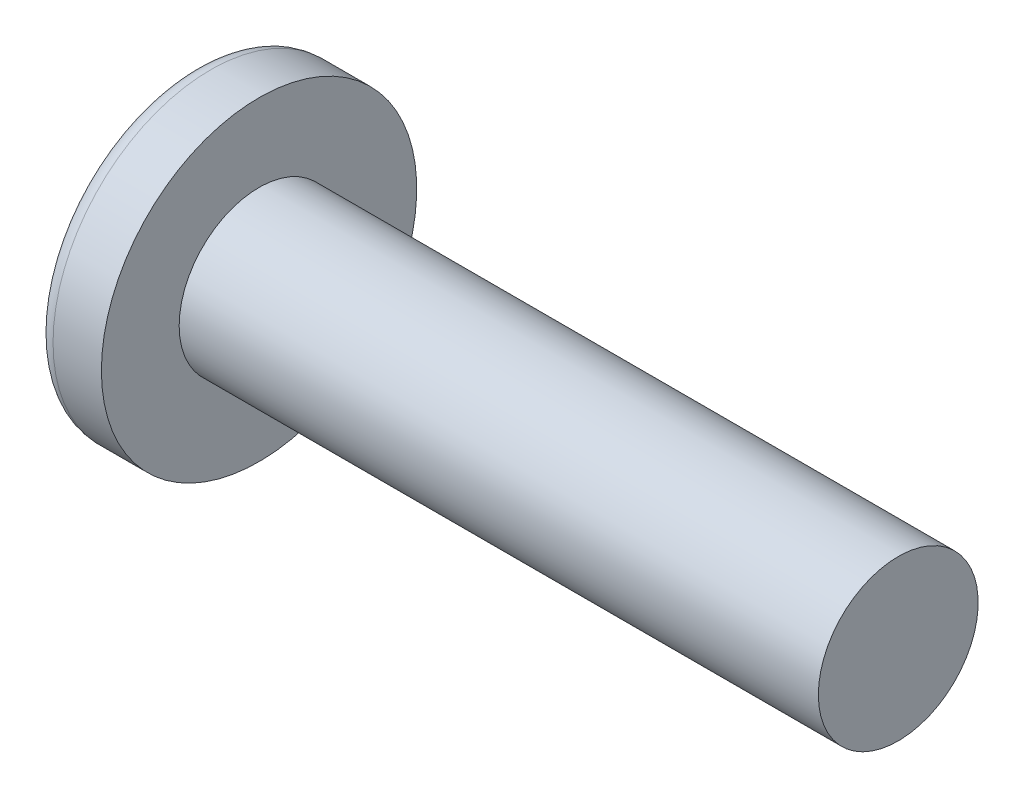
ISO-10303-21;
HEADER;
FILE_DESCRIPTION(('STEP AP214'),'2;1');
FILE_NAME('part.step','',(''),(''),'','','');
FILE_SCHEMA(('AUTOMOTIVE_DESIGN { 1 0 10303 214 1 1 1 1 }'));
ENDSEC;
DATA;
#1=APPLICATION_CONTEXT('core data for automotive mechanical design processes');
#2=APPLICATION_PROTOCOL_DEFINITION('international standard','automotive_design',2000,#1);
#3=PRODUCT_CONTEXT('',#1,'mechanical');
#4=PRODUCT('Part','Part','',(#3));
#5=PRODUCT_RELATED_PRODUCT_CATEGORY('part','',(#4));
#6=PRODUCT_DEFINITION_FORMATION('','',#4);
#7=PRODUCT_DEFINITION_CONTEXT('part definition',#1,'design');
#8=PRODUCT_DEFINITION('design','',#6,#7);
#9=PRODUCT_DEFINITION_SHAPE('','',#8);
#10=(LENGTH_UNIT() NAMED_UNIT(*) SI_UNIT(.MILLI.,.METRE.));
#11=(NAMED_UNIT(*) PLANE_ANGLE_UNIT() SI_UNIT($,.RADIAN.));
#12=(NAMED_UNIT(*) SI_UNIT($,.STERADIAN.) SOLID_ANGLE_UNIT());
#13=UNCERTAINTY_MEASURE_WITH_UNIT(LENGTH_MEASURE(1.E-05),#10,'distance_accuracy_value','');
#14=(GEOMETRIC_REPRESENTATION_CONTEXT(3) GLOBAL_UNCERTAINTY_ASSIGNED_CONTEXT((#13)) GLOBAL_UNIT_ASSIGNED_CONTEXT((#10,
#11,#12)) REPRESENTATION_CONTEXT('',''));
#15=CARTESIAN_POINT('',(0.,0.,0.));
#16=DIRECTION('',(0.,0.,1.));
#17=DIRECTION('',(1.,0.,0.));
#18=AXIS2_PLACEMENT_3D('',#15,#16,#17);
#19=CARTESIAN_POINT('',(15.24,0.,0.));
#20=DIRECTION('',(-1.,0.,0.));
#21=DIRECTION('',(0.,1.,0.));
#22=AXIS2_PLACEMENT_3D('',#19,#20,#21);
#23=SPHERICAL_SURFACE('',#22,15.24);
#24=CARTESIAN_POINT('',(2.92722732613133,0.,0.));
#25=DIRECTION('',(-1.,0.,0.));
#26=DIRECTION('',(0.,0.,1.));
#27=AXIS2_PLACEMENT_3D('',#24,#25,#26);
#28=CIRCLE('',#27,8.98071428571429);
#29=CARTESIAN_POINT('',(2.92722732613133,0.,8.98071428571429));
#30=VERTEX_POINT('',#29);
#31=EDGE_CURVE('E152',#30,#30,#28,.T.);
#32=ORIENTED_EDGE('',*,*,#31,.T.);
#33=EDGE_LOOP('',(#32));
#34=FACE_BOUND('',#33,.T.);
#35=CARTESIAN_POINT('',(15.2364523729621,-0.0501047571765164,0.));
#36=DIRECTION('',(-0.0706273813304668,-0.997502768420419,0.));
#37=DIRECTION('',(0.99750276842042,-0.0706273813304668,0.));
#38=AXIS2_PLACEMENT_3D('',#35,#36,#37);
#39=CIRCLE('',#38,15.239917221811);
#40=CARTESIAN_POINT('',(0.995146707085349,0.95823943769761,5.33137241649649));
#41=VERTEX_POINT('',#40);
#42=CARTESIAN_POINT('',(0.0689357960781643,1.02381905639656,1.02381905639656));
#43=VERTEX_POINT('',#42);
#44=EDGE_CURVE('E183',#41,#43,#39,.T.);
#45=ORIENTED_EDGE('',*,*,#44,.F.);
#46=CARTESIAN_POINT('',(12.5278255385737,0.,-3.52983797937615));
#47=DIRECTION('',(0.609275198020805,0.,0.79295884702594));
#48=DIRECTION('',(0.79295884702594,0.,-0.609275198020805));
#49=AXIS2_PLACEMENT_3D('',#46,#47,#48);
#50=CIRCLE('',#49,14.5753886236402);
#51=CARTESIAN_POINT('',(0.995146707085349,-0.958239437697647,5.33137241649648));
#52=VERTEX_POINT('',#51);
#53=EDGE_CURVE('E148',#41,#52,#50,.T.);
#54=ORIENTED_EDGE('',*,*,#53,.T.);
#55=CARTESIAN_POINT('',(15.2364523729621,0.0501047571765147,0.));
#56=DIRECTION('',(-0.0706273813304666,0.997502768420419,0.));
#57=DIRECTION('',(-0.99750276842042,-0.0706273813304666,0.));
#58=AXIS2_PLACEMENT_3D('',#55,#56,#57);
#59=CIRCLE('',#58,15.239917221811);
#60=CARTESIAN_POINT('',(0.0689357960781626,-1.02381905639657,1.02381905639656));
#61=VERTEX_POINT('',#60);
#62=EDGE_CURVE('E104',#61,#52,#59,.T.);
#63=ORIENTED_EDGE('',*,*,#62,.F.);
#64=CARTESIAN_POINT('',(15.2364523729621,0.,-0.0501047571765148));
#65=DIRECTION('',(-0.0706273813304666,0.,-0.997502768420419));
#66=DIRECTION('',(-0.99750276842042,0.,0.0706273813304666));
#67=AXIS2_PLACEMENT_3D('',#64,#65,#66);
#68=CIRCLE('',#67,15.239917221811);
#69=CARTESIAN_POINT('',(0.995146707085344,-5.33137241649649,0.958239437697627));
#70=VERTEX_POINT('',#69);
#71=EDGE_CURVE('E129',#70,#61,#68,.T.);
#72=ORIENTED_EDGE('',*,*,#71,.F.);
#73=CARTESIAN_POINT('',(12.5278255385737,3.52983797937615,0.));
#74=DIRECTION('',(0.609275198020805,-0.79295884702594,0.));
#75=DIRECTION('',(0.79295884702594,0.609275198020805,0.));
#76=AXIS2_PLACEMENT_3D('',#73,#74,#75);
#77=CIRCLE('',#76,14.5753886236402);
#78=CARTESIAN_POINT('',(0.995146707085344,-5.33137241649649,-0.958239437697628));
#79=VERTEX_POINT('',#78);
#80=EDGE_CURVE('E137',#70,#79,#77,.T.);
#81=ORIENTED_EDGE('',*,*,#80,.T.);
#82=CARTESIAN_POINT('',(15.2364523729621,0.,0.0501047571765163));
#83=DIRECTION('',(-0.0706273813304668,0.,0.997502768420419));
#84=DIRECTION('',(0.99750276842042,0.,0.0706273813304668));
#85=AXIS2_PLACEMENT_3D('',#82,#83,#84);
#86=CIRCLE('',#85,15.239917221811);
#87=CARTESIAN_POINT('',(0.0689357960781626,-1.02381905639656,-1.02381905639656));
#88=VERTEX_POINT('',#87);
#89=EDGE_CURVE('E47',#88,#79,#86,.T.);
#90=ORIENTED_EDGE('',*,*,#89,.F.);
#91=CARTESIAN_POINT('',(0.995146707085349,-0.958239437697608,-5.33137241649649));
#92=VERTEX_POINT('',#91);
#93=EDGE_CURVE('E190',#92,#88,#59,.T.);
#94=ORIENTED_EDGE('',*,*,#93,.F.);
#95=CARTESIAN_POINT('',(12.5278255385737,0.,3.52983797937615));
#96=DIRECTION('',(0.609275198020805,0.,-0.79295884702594));
#97=DIRECTION('',(-0.79295884702594,0.,-0.609275198020805));
#98=AXIS2_PLACEMENT_3D('',#95,#96,#97);
#99=CIRCLE('',#98,14.5753886236402);
#100=CARTESIAN_POINT('',(0.995146707085351,0.958239437697647,-5.33137241649648));
#101=VERTEX_POINT('',#100);
#102=EDGE_CURVE('E130',#92,#101,#99,.T.);
#103=ORIENTED_EDGE('',*,*,#102,.T.);
#104=CARTESIAN_POINT('',(0.0689357960781643,1.02381905639657,-1.02381905639656));
#105=VERTEX_POINT('',#104);
#106=EDGE_CURVE('E178',#105,#101,#39,.T.);
#107=ORIENTED_EDGE('',*,*,#106,.F.);
#108=CARTESIAN_POINT('',(0.995146707085353,5.33137241649648,-0.958239437697628));
#109=VERTEX_POINT('',#108);
#110=EDGE_CURVE('E40',#109,#105,#86,.T.);
#111=ORIENTED_EDGE('',*,*,#110,.F.);
#112=CARTESIAN_POINT('',(12.5278255385737,-3.52983797937616,0.));
#113=DIRECTION('',(0.609275198020805,0.79295884702594,0.));
#114=DIRECTION('',(-0.79295884702594,0.609275198020805,0.));
#115=AXIS2_PLACEMENT_3D('',#112,#113,#114);
#116=CIRCLE('',#115,14.5753886236402);
#117=CARTESIAN_POINT('',(0.995146707085353,5.33137241649648,0.958239437697628));
#118=VERTEX_POINT('',#117);
#119=EDGE_CURVE('E11',#109,#118,#116,.T.);
#120=ORIENTED_EDGE('',*,*,#119,.T.);
#121=EDGE_CURVE('E166',#43,#118,#68,.T.);
#122=ORIENTED_EDGE('',*,*,#121,.F.);
#123=EDGE_LOOP('',(#45,#54,#63,#72,#81,#90,#94,#103,#107,#111,#120,#122));
#124=FACE_BOUND('',#123,.T.);
#125=ADVANCED_FACE('F32',(#34,#124),#23,.T.);
#126=CARTESIAN_POINT('',(7.9338156996587,0.,-0.466952559726962));
#127=DIRECTION('',(-0.0706273813304668,0.,0.997502768420419));
#128=DIRECTION('',(0.99750276842042,0.,0.0706273813304668));
#129=AXIS2_PLACEMENT_3D('',#126,#127,#128);
#130=PLANE('',#129);
#131=ORIENTED_EDGE('',*,*,#110,.T.);
#132=DIRECTION('',(0.995024152382142,-0.0704518849151694,0.0704518849151692));
#133=VECTOR('',#132,1.);
#134=CARTESIAN_POINT('',(7.96654969377497,0.464634855598102,-0.464634855598101));
#135=LINE('',#134,#133);
#136=CARTESIAN_POINT('',(7.2644,0.514350000000002,-0.514349999999998));
#137=VERTEX_POINT('',#136);
#138=EDGE_CURVE('E172',#105,#137,#135,.T.);
#139=ORIENTED_EDGE('',*,*,#138,.T.);
#140=DIRECTION('',(0.791711995704343,-0.608317171524578,0.056056531164381));
#141=VECTOR('',#140,1.);
#142=CARTESIAN_POINT('',(0.,6.096,-1.0287));
#143=LINE('',#142,#141);
#144=EDGE_CURVE('E153',#109,#137,#143,.T.);
#145=ORIENTED_EDGE('',*,*,#144,.F.);
#146=EDGE_LOOP('',(#131,#139,#145));
#147=FACE_BOUND('',#146,.T.);
#148=ADVANCED_FACE('F171',(#147),#130,.T.);
#149=DIRECTION('',(0.791711995704343,0.608317171524578,0.056056531164381));
#150=VECTOR('',#149,1.);
#151=CARTESIAN_POINT('',(0.,-6.096,-1.0287));
#152=LINE('',#151,#150);
#153=CARTESIAN_POINT('',(7.2644,-0.51435,-0.51435));
#154=VERTEX_POINT('',#153);
#155=EDGE_CURVE('E138',#79,#154,#152,.T.);
#156=ORIENTED_EDGE('',*,*,#155,.T.);
#157=DIRECTION('',(-0.995024152382142,-0.0704518849151687,-0.0704518849151692));
#158=VECTOR('',#157,1.);
#159=CARTESIAN_POINT('',(7.96654969377497,-0.464634855598099,-0.464634855598101));
#160=LINE('',#159,#158);
#161=EDGE_CURVE('E193',#154,#88,#160,.T.);
#162=ORIENTED_EDGE('',*,*,#161,.T.);
#163=ORIENTED_EDGE('',*,*,#89,.T.);
#164=EDGE_LOOP('',(#156,#162,#163));
#165=FACE_BOUND('',#164,.T.);
#166=ADVANCED_FACE('F208',(#165),#130,.T.);
#167=CARTESIAN_POINT('',(7.9338156996587,0.,0.466952559726962));
#168=DIRECTION('',(-0.0706273813304666,0.,-0.997502768420419));
#169=DIRECTION('',(-0.99750276842042,0.,0.0706273813304666));
#170=AXIS2_PLACEMENT_3D('',#167,#168,#169);
#171=PLANE('',#170);
#172=DIRECTION('',(0.791711995704343,-0.608317171524578,-0.0560565311643809));
#173=VECTOR('',#172,1.);
#174=CARTESIAN_POINT('',(0.,6.096,1.0287));
#175=LINE('',#174,#173);
#176=CARTESIAN_POINT('',(7.2644,0.51435,0.51435));
#177=VERTEX_POINT('',#176);
#178=EDGE_CURVE('E209',#118,#177,#175,.T.);
#179=ORIENTED_EDGE('',*,*,#178,.T.);
#180=DIRECTION('',(-0.995024152382142,0.0704518849151689,0.070451884915169));
#181=VECTOR('',#180,1.);
#182=CARTESIAN_POINT('',(7.96654969377497,0.464634855598099,0.464634855598101));
#183=LINE('',#182,#181);
#184=EDGE_CURVE('E187',#177,#43,#183,.T.);
#185=ORIENTED_EDGE('',*,*,#184,.T.);
#186=ORIENTED_EDGE('',*,*,#121,.T.);
#187=EDGE_LOOP('',(#179,#185,#186));
#188=FACE_BOUND('',#187,.T.);
#189=ADVANCED_FACE('F213',(#188),#171,.T.);
#190=ORIENTED_EDGE('',*,*,#71,.T.);
#191=DIRECTION('',(0.995024152382142,0.0704518849151692,-0.070451884915169));
#192=VECTOR('',#191,1.);
#193=CARTESIAN_POINT('',(7.96654969377497,-0.464634855598103,0.464634855598101));
#194=LINE('',#193,#192);
#195=CARTESIAN_POINT('',(7.2644,-0.514350000000002,0.514349999999998));
#196=VERTEX_POINT('',#195);
#197=EDGE_CURVE('E102',#61,#196,#194,.T.);
#198=ORIENTED_EDGE('',*,*,#197,.T.);
#199=DIRECTION('',(0.791711995704343,0.608317171524578,-0.0560565311643808));
#200=VECTOR('',#199,1.);
#201=CARTESIAN_POINT('',(0.,-6.096,1.0287));
#202=LINE('',#201,#200);
#203=EDGE_CURVE('E127',#70,#196,#202,.T.);
#204=ORIENTED_EDGE('',*,*,#203,.F.);
#205=EDGE_LOOP('',(#190,#198,#204));
#206=FACE_BOUND('',#205,.T.);
#207=ADVANCED_FACE('F126',(#206),#171,.T.);
#208=CARTESIAN_POINT('',(-25.4,0.,0.));
#209=DIRECTION('',(-1.,0.,0.));
#210=DIRECTION('',(0.,0.,1.));
#211=AXIS2_PLACEMENT_3D('',#208,#209,#210);
#212=CYLINDRICAL_SURFACE('',#211,4.7625);
#213=CARTESIAN_POINT('',(44.7294,0.,0.));
#214=DIRECTION('',(-1.,0.,0.));
#215=DIRECTION('',(0.,0.,1.));
#216=AXIS2_PLACEMENT_3D('',#213,#214,#215);
#217=CIRCLE('',#216,4.7625);
#218=CARTESIAN_POINT('',(44.7294,0.,4.7625));
#219=VERTEX_POINT('',#218);
#220=EDGE_CURVE('E149',#219,#219,#217,.T.);
#221=ORIENTED_EDGE('',*,*,#220,.T.);
#222=EDGE_LOOP('',(#221));
#223=FACE_BOUND('',#222,.T.);
#224=CARTESIAN_POINT('',(6.6294,0.,0.));
#225=DIRECTION('',(-1.,0.,0.));
#226=DIRECTION('',(0.,0.,1.));
#227=AXIS2_PLACEMENT_3D('',#224,#225,#226);
#228=CIRCLE('',#227,4.7625);
#229=CARTESIAN_POINT('',(6.6294,0.,4.7625));
#230=VERTEX_POINT('',#229);
#231=EDGE_CURVE('E162',#230,#230,#228,.T.);
#232=ORIENTED_EDGE('',*,*,#231,.F.);
#233=EDGE_LOOP('',(#232));
#234=FACE_BOUND('',#233,.T.);
#235=ADVANCED_FACE('F34',(#223,#234),#212,.T.);
#236=CARTESIAN_POINT('',(6.6294,4.7625,0.));
#237=DIRECTION('',(-1.,0.,0.));
#238=DIRECTION('',(0.,0.,1.));
#239=AXIS2_PLACEMENT_3D('',#236,#237,#238);
#240=PLANE('',#239);
#241=CARTESIAN_POINT('',(6.6294,0.,0.));
#242=DIRECTION('',(-1.,0.,0.));
#243=DIRECTION('',(0.,0.,1.));
#244=AXIS2_PLACEMENT_3D('',#241,#242,#243);
#245=CIRCLE('',#244,9.398);
#246=CARTESIAN_POINT('',(6.6294,0.,9.398));
#247=VERTEX_POINT('',#246);
#248=EDGE_CURVE('E159',#247,#247,#245,.T.);
#249=ORIENTED_EDGE('',*,*,#248,.F.);
#250=EDGE_LOOP('',(#249));
#251=FACE_BOUND('',#250,.T.);
#252=ORIENTED_EDGE('',*,*,#231,.T.);
#253=EDGE_LOOP('',(#252));
#254=FACE_BOUND('',#253,.T.);
#255=ADVANCED_FACE('F241',(#251,#254),#240,.F.);
#256=CARTESIAN_POINT('',(-25.4,0.,0.));
#257=DIRECTION('',(-1.,0.,0.));
#258=DIRECTION('',(0.,0.,1.));
#259=AXIS2_PLACEMENT_3D('',#256,#257,#258);
#260=CYLINDRICAL_SURFACE('',#259,9.398);
#261=ORIENTED_EDGE('',*,*,#248,.T.);
#262=EDGE_LOOP('',(#261));
#263=FACE_BOUND('',#262,.T.);
#264=CARTESIAN_POINT('',(3.74807883772257,0.,0.));
#265=DIRECTION('',(-1.,0.,0.));
#266=DIRECTION('',(0.,0.,1.));
#267=AXIS2_PLACEMENT_3D('',#264,#265,#266);
#268=CIRCLE('',#267,9.398);
#269=CARTESIAN_POINT('',(3.74807883772257,0.,9.398));
#270=VERTEX_POINT('',#269);
#271=EDGE_CURVE('E156',#270,#270,#268,.T.);
#272=ORIENTED_EDGE('',*,*,#271,.F.);
#273=EDGE_LOOP('',(#272));
#274=FACE_BOUND('',#273,.T.);
#275=ADVANCED_FACE('F238',(#263,#274),#260,.T.);
#276=CARTESIAN_POINT('',(3.74807883772257,0.,0.));
#277=DIRECTION('',(-1.,0.,0.));
#278=DIRECTION('',(0.,0.,1.));
#279=AXIS2_PLACEMENT_3D('',#276,#277,#278);
#280=TOROIDAL_SURFACE('',#279,8.382,1.016);
#281=ORIENTED_EDGE('',*,*,#271,.T.);
#282=EDGE_LOOP('',(#281));
#283=FACE_BOUND('',#282,.T.);
#284=ORIENTED_EDGE('',*,*,#31,.F.);
#285=EDGE_LOOP('',(#284));
#286=FACE_BOUND('',#285,.T.);
#287=ADVANCED_FACE('F235',(#283,#286),#280,.T.);
#288=CARTESIAN_POINT('',(44.7294,4.7625,0.));
#289=DIRECTION('',(1.,0.,0.));
#290=DIRECTION('',(0.,0.,-1.));
#291=AXIS2_PLACEMENT_3D('',#288,#289,#290);
#292=PLANE('',#291);
#293=ORIENTED_EDGE('',*,*,#220,.F.);
#294=EDGE_LOOP('',(#293));
#295=FACE_BOUND('',#294,.T.);
#296=ADVANCED_FACE('F233',(#295),#292,.T.);
#297=CARTESIAN_POINT('',(0.,6.096,1.0287));
#298=DIRECTION('',(0.609275198020805,0.79295884702594,0.));
#299=DIRECTION('',(-0.79295884702594,0.609275198020805,0.));
#300=AXIS2_PLACEMENT_3D('',#297,#298,#299);
#301=PLANE('',#300);
#302=ORIENTED_EDGE('',*,*,#144,.T.);
#303=DIRECTION('',(0.,0.,-1.));
#304=VECTOR('',#303,1.);
#305=CARTESIAN_POINT('',(7.2644,0.51435,0.51435));
#306=LINE('',#305,#304);
#307=EDGE_CURVE('E120',#177,#137,#306,.T.);
#308=ORIENTED_EDGE('',*,*,#307,.F.);
#309=ORIENTED_EDGE('',*,*,#178,.F.);
#310=ORIENTED_EDGE('',*,*,#119,.F.);
#311=EDGE_LOOP('',(#302,#308,#309,#310));
#312=FACE_BOUND('',#311,.T.);
#313=ADVANCED_FACE('F212',(#312),#301,.F.);
#314=CARTESIAN_POINT('',(7.2644,-0.51435,-0.51435));
#315=DIRECTION('',(0.609275198020805,-0.79295884702594,0.));
#316=DIRECTION('',(0.79295884702594,0.609275198020805,0.));
#317=AXIS2_PLACEMENT_3D('',#314,#315,#316);
#318=PLANE('',#317);
#319=ORIENTED_EDGE('',*,*,#203,.T.);
#320=DIRECTION('',(0.,0.,1.));
#321=VECTOR('',#320,1.);
#322=CARTESIAN_POINT('',(7.2644,-0.51435,-0.51435));
#323=LINE('',#322,#321);
#324=EDGE_CURVE('E119',#154,#196,#323,.T.);
#325=ORIENTED_EDGE('',*,*,#324,.F.);
#326=ORIENTED_EDGE('',*,*,#155,.F.);
#327=ORIENTED_EDGE('',*,*,#80,.F.);
#328=EDGE_LOOP('',(#319,#325,#326,#327));
#329=FACE_BOUND('',#328,.T.);
#330=ADVANCED_FACE('F134',(#329),#318,.F.);
#331=CARTESIAN_POINT('',(7.2644,0.51435,-0.51435));
#332=DIRECTION('',(-1.,0.,0.));
#333=DIRECTION('',(0.,0.,1.));
#334=AXIS2_PLACEMENT_3D('',#331,#332,#333);
#335=PLANE('',#334);
#336=DIRECTION('',(0.,1.,0.));
#337=VECTOR('',#336,1.);
#338=CARTESIAN_POINT('',(7.2644,-0.51435,-0.51435));
#339=LINE('',#338,#337);
#340=EDGE_CURVE('E142',#154,#137,#339,.T.);
#341=ORIENTED_EDGE('',*,*,#340,.F.);
#342=ORIENTED_EDGE('',*,*,#324,.T.);
#343=DIRECTION('',(0.,-1.,0.));
#344=VECTOR('',#343,1.);
#345=CARTESIAN_POINT('',(7.2644,0.51435,0.51435));
#346=LINE('',#345,#344);
#347=EDGE_CURVE('E111',#177,#196,#346,.T.);
#348=ORIENTED_EDGE('',*,*,#347,.F.);
#349=ORIENTED_EDGE('',*,*,#307,.T.);
#350=EDGE_LOOP('',(#341,#342,#348,#349));
#351=FACE_BOUND('',#350,.T.);
#352=ADVANCED_FACE('F140',(#351),#335,.T.);
#353=CARTESIAN_POINT('',(7.2644,0.514350000000002,-0.514349999999998));
#354=DIRECTION('',(0.609275198020805,0.,-0.79295884702594));
#355=DIRECTION('',(0.79295884702594,0.,0.609275198020805));
#356=AXIS2_PLACEMENT_3D('',#353,#354,#355);
#357=PLANE('',#356);
#358=DIRECTION('',(0.791711995704343,0.0560565311643786,0.608317171524578));
#359=VECTOR('',#358,1.);
#360=CARTESIAN_POINT('',(0.,-1.02869999999998,-6.096));
#361=LINE('',#360,#359);
#362=EDGE_CURVE('E198',#92,#154,#361,.T.);
#363=ORIENTED_EDGE('',*,*,#362,.T.);
#364=ORIENTED_EDGE('',*,*,#340,.T.);
#365=DIRECTION('',(0.791711995704343,-0.0560565311643831,0.608317171524578));
#366=VECTOR('',#365,1.);
#367=CARTESIAN_POINT('',(0.,1.02870000000002,-6.096));
#368=LINE('',#367,#366);
#369=EDGE_CURVE('E108',#101,#137,#368,.T.);
#370=ORIENTED_EDGE('',*,*,#369,.F.);
#371=ORIENTED_EDGE('',*,*,#102,.F.);
#372=EDGE_LOOP('',(#363,#364,#370,#371));
#373=FACE_BOUND('',#372,.T.);
#374=ADVANCED_FACE('F203',(#373),#357,.F.);
#375=CARTESIAN_POINT('',(7.9338156996587,-0.466952559726962,0.));
#376=DIRECTION('',(-0.0706273813304666,0.997502768420419,0.));
#377=DIRECTION('',(-0.99750276842042,-0.0706273813304666,0.));
#378=AXIS2_PLACEMENT_3D('',#375,#376,#377);
#379=PLANE('',#378);
#380=ORIENTED_EDGE('',*,*,#93,.T.);
#381=ORIENTED_EDGE('',*,*,#161,.F.);
#382=ORIENTED_EDGE('',*,*,#362,.F.);
#383=EDGE_LOOP('',(#380,#381,#382));
#384=FACE_BOUND('',#383,.T.);
#385=ADVANCED_FACE('F207',(#384),#379,.T.);
#386=CARTESIAN_POINT('',(7.9338156996587,0.466952559726962,0.));
#387=DIRECTION('',(-0.0706273813304668,-0.997502768420419,0.));
#388=DIRECTION('',(0.99750276842042,-0.0706273813304668,0.));
#389=AXIS2_PLACEMENT_3D('',#386,#387,#388);
#390=PLANE('',#389);
#391=ORIENTED_EDGE('',*,*,#106,.T.);
#392=ORIENTED_EDGE('',*,*,#369,.T.);
#393=ORIENTED_EDGE('',*,*,#138,.F.);
#394=EDGE_LOOP('',(#391,#392,#393));
#395=FACE_BOUND('',#394,.T.);
#396=ADVANCED_FACE('F201',(#395),#390,.T.);
#397=CARTESIAN_POINT('',(0.,-1.02870000000002,6.096));
#398=DIRECTION('',(0.609275198020805,0.,0.79295884702594));
#399=DIRECTION('',(-0.79295884702594,0.,0.609275198020805));
#400=AXIS2_PLACEMENT_3D('',#397,#398,#399);
#401=PLANE('',#400);
#402=DIRECTION('',(0.791711995704343,-0.0560565311643788,-0.608317171524579));
#403=VECTOR('',#402,1.);
#404=CARTESIAN_POINT('',(0.,1.02869999999998,6.096));
#405=LINE('',#404,#403);
#406=EDGE_CURVE('E107',#41,#177,#405,.T.);
#407=ORIENTED_EDGE('',*,*,#406,.T.);
#408=ORIENTED_EDGE('',*,*,#347,.T.);
#409=DIRECTION('',(0.791711995704343,0.056056531164383,-0.608317171524578));
#410=VECTOR('',#409,1.);
#411=CARTESIAN_POINT('',(0.,-1.02870000000002,6.096));
#412=LINE('',#411,#410);
#413=EDGE_CURVE('E98',#52,#196,#412,.T.);
#414=ORIENTED_EDGE('',*,*,#413,.F.);
#415=ORIENTED_EDGE('',*,*,#53,.F.);
#416=EDGE_LOOP('',(#407,#408,#414,#415));
#417=FACE_BOUND('',#416,.T.);
#418=ADVANCED_FACE('F112',(#417),#401,.F.);
#419=ORIENTED_EDGE('',*,*,#44,.T.);
#420=ORIENTED_EDGE('',*,*,#184,.F.);
#421=ORIENTED_EDGE('',*,*,#406,.F.);
#422=EDGE_LOOP('',(#419,#420,#421));
#423=FACE_BOUND('',#422,.T.);
#424=ADVANCED_FACE('F214',(#423),#390,.T.);
#425=ORIENTED_EDGE('',*,*,#62,.T.);
#426=ORIENTED_EDGE('',*,*,#413,.T.);
#427=ORIENTED_EDGE('',*,*,#197,.F.);
#428=EDGE_LOOP('',(#425,#426,#427));
#429=FACE_BOUND('',#428,.T.);
#430=ADVANCED_FACE('F100',(#429),#379,.T.);
#431=CLOSED_SHELL('',(#125,#148,#166,#189,#207,#235,#255,#275,#287,#296,#313,#330,#352,#374,
#385,#396,#418,#424,#430));
#432=MANIFOLD_SOLID_BREP('B2',#431);
#433=ADVANCED_BREP_SHAPE_REPRESENTATION('',(#18,#432),#14);
#434=SHAPE_DEFINITION_REPRESENTATION(#9,#433);
ENDSEC;
END-ISO-10303-21;
